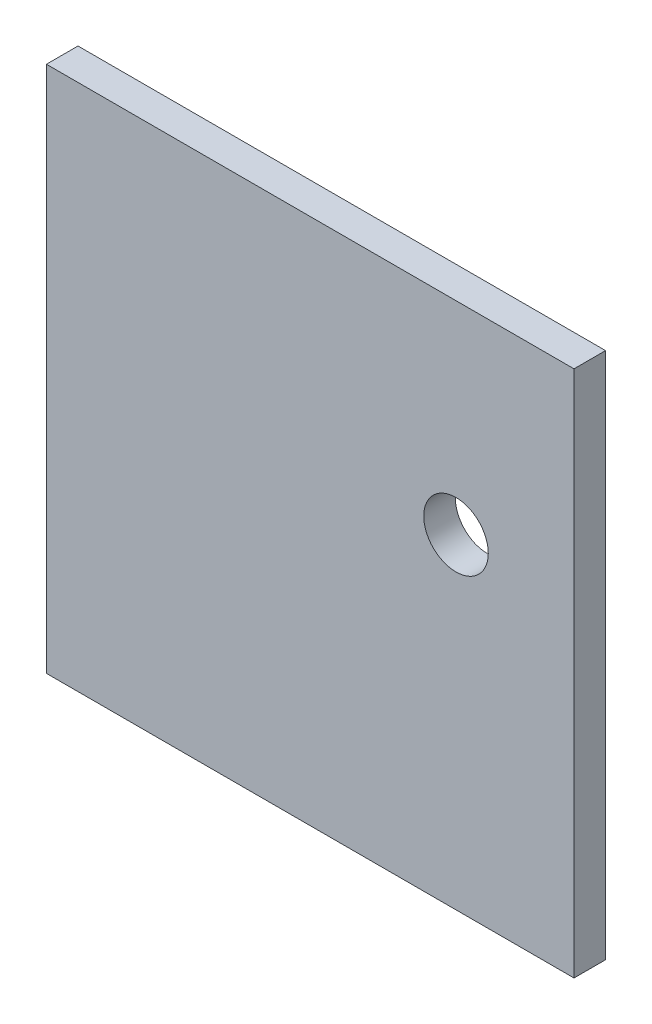
ISO-10303-21;
HEADER;
FILE_DESCRIPTION(('STEP AP214'),'2;1');
FILE_NAME('part.step','',(''),(''),'','','');
FILE_SCHEMA(('AUTOMOTIVE_DESIGN { 1 0 10303 214 1 1 1 1 }'));
ENDSEC;
DATA;
#1=APPLICATION_CONTEXT('core data for automotive mechanical design processes');
#2=APPLICATION_PROTOCOL_DEFINITION('international standard','automotive_design',2000,#1);
#3=PRODUCT_CONTEXT('',#1,'mechanical');
#4=PRODUCT('Part','Part','',(#3));
#5=PRODUCT_RELATED_PRODUCT_CATEGORY('part','',(#4));
#6=PRODUCT_DEFINITION_FORMATION('','',#4);
#7=PRODUCT_DEFINITION_CONTEXT('part definition',#1,'design');
#8=PRODUCT_DEFINITION('design','',#6,#7);
#9=PRODUCT_DEFINITION_SHAPE('','',#8);
#10=(LENGTH_UNIT() NAMED_UNIT(*) SI_UNIT(.MILLI.,.METRE.));
#11=(NAMED_UNIT(*) PLANE_ANGLE_UNIT() SI_UNIT($,.RADIAN.));
#12=(NAMED_UNIT(*) SI_UNIT($,.STERADIAN.) SOLID_ANGLE_UNIT());
#13=UNCERTAINTY_MEASURE_WITH_UNIT(LENGTH_MEASURE(1.E-05),#10,'distance_accuracy_value','');
#14=(GEOMETRIC_REPRESENTATION_CONTEXT(3) GLOBAL_UNCERTAINTY_ASSIGNED_CONTEXT((#13)) GLOBAL_UNIT_ASSIGNED_CONTEXT((#10,
#11,#12)) REPRESENTATION_CONTEXT('',''));
#15=CARTESIAN_POINT('',(0.,0.,0.));
#16=DIRECTION('',(0.,0.,1.));
#17=DIRECTION('',(1.,0.,0.));
#18=AXIS2_PLACEMENT_3D('',#15,#16,#17);
#19=CARTESIAN_POINT('',(-76.4143212356991,-76.4143212356991,-9.14399999999999));
#20=DIRECTION('',(-1.,0.,0.));
#21=DIRECTION('',(0.,0.,1.));
#22=AXIS2_PLACEMENT_3D('',#19,#20,#21);
#23=PLANE('',#22);
#24=DIRECTION('',(0.,-1.,0.));
#25=VECTOR('',#24,1.);
#26=CARTESIAN_POINT('',(-76.4143212356991,-76.4143212356991,0.));
#27=LINE('',#26,#25);
#28=CARTESIAN_POINT('',(-76.4143212356991,76.4143212356991,0.));
#29=VERTEX_POINT('',#28);
#30=CARTESIAN_POINT('',(-76.4143212356991,-76.4143212356991,0.));
#31=VERTEX_POINT('',#30);
#32=EDGE_CURVE('E96',#29,#31,#27,.T.);
#33=ORIENTED_EDGE('',*,*,#32,.F.);
#34=DIRECTION('',(0.,0.,1.));
#35=VECTOR('',#34,1.);
#36=CARTESIAN_POINT('',(-76.4143212356991,76.4143212356991,-9.14399999999999));
#37=LINE('',#36,#35);
#38=CARTESIAN_POINT('',(-76.4143212356991,76.4143212356991,-9.14399999999999));
#39=VERTEX_POINT('',#38);
#40=EDGE_CURVE('E11',#39,#29,#37,.T.);
#41=ORIENTED_EDGE('',*,*,#40,.F.);
#42=DIRECTION('',(0.,-1.,0.));
#43=VECTOR('',#42,1.);
#44=CARTESIAN_POINT('',(-76.4143212356991,-76.4143212356991,-9.14399999999999));
#45=LINE('',#44,#43);
#46=CARTESIAN_POINT('',(-76.4143212356991,-76.4143212356991,-9.14399999999999));
#47=VERTEX_POINT('',#46);
#48=EDGE_CURVE('E89',#39,#47,#45,.T.);
#49=ORIENTED_EDGE('',*,*,#48,.T.);
#50=DIRECTION('',(0.,0.,1.));
#51=VECTOR('',#50,1.);
#52=CARTESIAN_POINT('',(-76.4143212356991,-76.4143212356991,-9.14399999999999));
#53=LINE('',#52,#51);
#54=EDGE_CURVE('E34',#47,#31,#53,.T.);
#55=ORIENTED_EDGE('',*,*,#54,.T.);
#56=EDGE_LOOP('',(#33,#41,#49,#55));
#57=FACE_BOUND('',#56,.T.);
#58=ADVANCED_FACE('F31',(#57),#23,.T.);
#59=CARTESIAN_POINT('',(-76.4143212356991,76.4143212356991,-9.14399999999999));
#60=DIRECTION('',(0.,1.,0.));
#61=DIRECTION('',(0.,0.,1.));
#62=AXIS2_PLACEMENT_3D('',#59,#60,#61);
#63=PLANE('',#62);
#64=DIRECTION('',(-1.,0.,0.));
#65=VECTOR('',#64,1.);
#66=CARTESIAN_POINT('',(-76.4143212356991,76.4143212356991,0.));
#67=LINE('',#66,#65);
#68=CARTESIAN_POINT('',(76.4143212356991,76.4143212356991,0.));
#69=VERTEX_POINT('',#68);
#70=EDGE_CURVE('E91',#69,#29,#67,.T.);
#71=ORIENTED_EDGE('',*,*,#70,.F.);
#72=DIRECTION('',(0.,0.,1.));
#73=VECTOR('',#72,1.);
#74=CARTESIAN_POINT('',(76.4143212356991,76.4143212356991,-9.14399999999999));
#75=LINE('',#74,#73);
#76=CARTESIAN_POINT('',(76.4143212356991,76.4143212356991,-9.14399999999999));
#77=VERTEX_POINT('',#76);
#78=EDGE_CURVE('E40',#77,#69,#75,.T.);
#79=ORIENTED_EDGE('',*,*,#78,.F.);
#80=DIRECTION('',(-1.,0.,0.));
#81=VECTOR('',#80,1.);
#82=CARTESIAN_POINT('',(-76.4143212356991,76.4143212356991,-9.14399999999999));
#83=LINE('',#82,#81);
#84=EDGE_CURVE('E86',#77,#39,#83,.T.);
#85=ORIENTED_EDGE('',*,*,#84,.T.);
#86=ORIENTED_EDGE('',*,*,#40,.T.);
#87=EDGE_LOOP('',(#71,#79,#85,#86));
#88=FACE_BOUND('',#87,.T.);
#89=ADVANCED_FACE('F107',(#88),#63,.T.);
#90=CARTESIAN_POINT('',(76.4143212356991,76.4143212356991,-9.14399999999999));
#91=DIRECTION('',(1.,0.,0.));
#92=DIRECTION('',(0.,0.,-1.));
#93=AXIS2_PLACEMENT_3D('',#90,#91,#92);
#94=PLANE('',#93);
#95=DIRECTION('',(0.,1.,0.));
#96=VECTOR('',#95,1.);
#97=CARTESIAN_POINT('',(76.4143212356991,76.4143212356991,0.));
#98=LINE('',#97,#96);
#99=CARTESIAN_POINT('',(76.4143212356991,-76.4143212356991,0.));
#100=VERTEX_POINT('',#99);
#101=EDGE_CURVE('E81',#100,#69,#98,.T.);
#102=ORIENTED_EDGE('',*,*,#101,.F.);
#103=DIRECTION('',(0.,0.,1.));
#104=VECTOR('',#103,1.);
#105=CARTESIAN_POINT('',(76.4143212356991,-76.4143212356991,-9.14399999999999));
#106=LINE('',#105,#104);
#107=CARTESIAN_POINT('',(76.4143212356991,-76.4143212356991,-9.14399999999999));
#108=VERTEX_POINT('',#107);
#109=EDGE_CURVE('E76',#108,#100,#106,.T.);
#110=ORIENTED_EDGE('',*,*,#109,.F.);
#111=DIRECTION('',(0.,1.,0.));
#112=VECTOR('',#111,1.);
#113=CARTESIAN_POINT('',(76.4143212356991,76.4143212356991,-9.14399999999999));
#114=LINE('',#113,#112);
#115=EDGE_CURVE('E79',#108,#77,#114,.T.);
#116=ORIENTED_EDGE('',*,*,#115,.T.);
#117=ORIENTED_EDGE('',*,*,#78,.T.);
#118=EDGE_LOOP('',(#102,#110,#116,#117));
#119=FACE_BOUND('',#118,.T.);
#120=ADVANCED_FACE('F78',(#119),#94,.T.);
#121=CARTESIAN_POINT('',(76.4143212356991,-76.4143212356991,-9.14399999999999));
#122=DIRECTION('',(0.,-1.,0.));
#123=DIRECTION('',(0.,0.,-1.));
#124=AXIS2_PLACEMENT_3D('',#121,#122,#123);
#125=PLANE('',#124);
#126=DIRECTION('',(1.,0.,0.));
#127=VECTOR('',#126,1.);
#128=CARTESIAN_POINT('',(76.4143212356991,-76.4143212356991,0.));
#129=LINE('',#128,#127);
#130=EDGE_CURVE('E99',#31,#100,#129,.T.);
#131=ORIENTED_EDGE('',*,*,#130,.F.);
#132=ORIENTED_EDGE('',*,*,#54,.F.);
#133=DIRECTION('',(1.,0.,0.));
#134=VECTOR('',#133,1.);
#135=CARTESIAN_POINT('',(76.4143212356991,-76.4143212356991,-9.14399999999999));
#136=LINE('',#135,#134);
#137=EDGE_CURVE('E85',#47,#108,#136,.T.);
#138=ORIENTED_EDGE('',*,*,#137,.T.);
#139=ORIENTED_EDGE('',*,*,#109,.T.);
#140=EDGE_LOOP('',(#131,#132,#138,#139));
#141=FACE_BOUND('',#140,.T.);
#142=ADVANCED_FACE('F88',(#141),#125,.T.);
#143=CARTESIAN_POINT('',(-76.4143212356991,76.4143212356991,-9.14399999999999));
#144=DIRECTION('',(0.,0.,-1.));
#145=DIRECTION('',(-1.,0.,0.));
#146=AXIS2_PLACEMENT_3D('',#143,#144,#145);
#147=PLANE('',#146);
#148=CARTESIAN_POINT('',(42.2342528985693,17.7047835990888,-9.14399999999999));
#149=DIRECTION('',(0.,0.,1.));
#150=DIRECTION('',(1.,0.,0.));
#151=AXIS2_PLACEMENT_3D('',#148,#149,#150);
#152=CIRCLE('',#151,9.3474263073092);
#153=CARTESIAN_POINT('',(51.5816792058785,17.7047835990888,-9.14399999999999));
#154=VERTEX_POINT('',#153);
#155=EDGE_CURVE('E100',#154,#154,#152,.T.);
#156=ORIENTED_EDGE('',*,*,#155,.T.);
#157=EDGE_LOOP('',(#156));
#158=FACE_BOUND('',#157,.T.);
#159=ORIENTED_EDGE('',*,*,#48,.F.);
#160=ORIENTED_EDGE('',*,*,#84,.F.);
#161=ORIENTED_EDGE('',*,*,#115,.F.);
#162=ORIENTED_EDGE('',*,*,#137,.F.);
#163=EDGE_LOOP('',(#159,#160,#161,#162));
#164=FACE_BOUND('',#163,.T.);
#165=ADVANCED_FACE('F84',(#158,#164),#147,.T.);
#166=CARTESIAN_POINT('',(-76.4143212356991,76.4143212356991,0.));
#167=DIRECTION('',(0.,0.,-1.));
#168=DIRECTION('',(-1.,0.,0.));
#169=AXIS2_PLACEMENT_3D('',#166,#167,#168);
#170=PLANE('',#169);
#171=CARTESIAN_POINT('',(42.2342528985693,17.7047835990888,0.));
#172=DIRECTION('',(0.,0.,1.));
#173=DIRECTION('',(1.,0.,0.));
#174=AXIS2_PLACEMENT_3D('',#171,#172,#173);
#175=CIRCLE('',#174,9.3474263073092);
#176=CARTESIAN_POINT('',(51.5816792058785,17.7047835990888,0.));
#177=VERTEX_POINT('',#176);
#178=EDGE_CURVE('E137',#177,#177,#175,.T.);
#179=ORIENTED_EDGE('',*,*,#178,.F.);
#180=EDGE_LOOP('',(#179));
#181=FACE_BOUND('',#180,.T.);
#182=ORIENTED_EDGE('',*,*,#32,.T.);
#183=ORIENTED_EDGE('',*,*,#130,.T.);
#184=ORIENTED_EDGE('',*,*,#101,.T.);
#185=ORIENTED_EDGE('',*,*,#70,.T.);
#186=EDGE_LOOP('',(#182,#183,#184,#185));
#187=FACE_BOUND('',#186,.T.);
#188=ADVANCED_FACE('F106',(#181,#187),#170,.F.);
#189=CARTESIAN_POINT('',(42.2342528985693,17.7047835990888,-9.14399999999999));
#190=DIRECTION('',(0.,0.,1.));
#191=DIRECTION('',(1.,0.,0.));
#192=AXIS2_PLACEMENT_3D('',#189,#190,#191);
#193=CYLINDRICAL_SURFACE('',#192,9.3474263073092);
#194=ORIENTED_EDGE('',*,*,#155,.F.);
#195=EDGE_LOOP('',(#194));
#196=FACE_BOUND('',#195,.T.);
#197=ORIENTED_EDGE('',*,*,#178,.T.);
#198=EDGE_LOOP('',(#197));
#199=FACE_BOUND('',#198,.T.);
#200=ADVANCED_FACE('F125',(#196,#199),#193,.F.);
#201=CLOSED_SHELL('',(#58,#89,#120,#142,#165,#188,#200));
#202=MANIFOLD_SOLID_BREP('B2',#201);
#203=ADVANCED_BREP_SHAPE_REPRESENTATION('',(#18,#202),#14);
#204=SHAPE_DEFINITION_REPRESENTATION(#9,#203);
ENDSEC;
END-ISO-10303-21;
